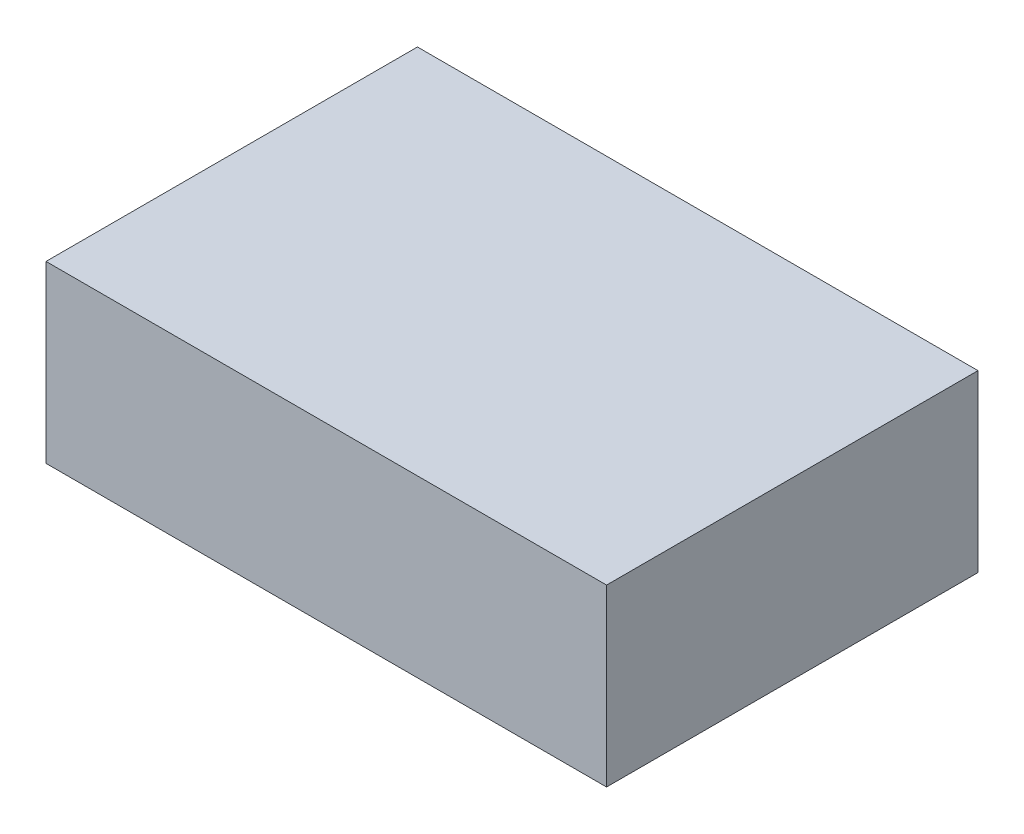
ISO-10303-21;
HEADER;
FILE_DESCRIPTION(('STEP AP214'),'2;1');
FILE_NAME('part.step','',(''),(''),'','','');
FILE_SCHEMA(('AUTOMOTIVE_DESIGN { 1 0 10303 214 1 1 1 1 }'));
ENDSEC;
DATA;
#1=APPLICATION_CONTEXT('core data for automotive mechanical design processes');
#2=APPLICATION_PROTOCOL_DEFINITION('international standard','automotive_design',2000,#1);
#3=PRODUCT_CONTEXT('',#1,'mechanical');
#4=PRODUCT('Part','Part','',(#3));
#5=PRODUCT_RELATED_PRODUCT_CATEGORY('part','',(#4));
#6=PRODUCT_DEFINITION_FORMATION('','',#4);
#7=PRODUCT_DEFINITION_CONTEXT('part definition',#1,'design');
#8=PRODUCT_DEFINITION('design','',#6,#7);
#9=PRODUCT_DEFINITION_SHAPE('','',#8);
#10=(LENGTH_UNIT() NAMED_UNIT(*) SI_UNIT(.MILLI.,.METRE.));
#11=(NAMED_UNIT(*) PLANE_ANGLE_UNIT() SI_UNIT($,.RADIAN.));
#12=(NAMED_UNIT(*) SI_UNIT($,.STERADIAN.) SOLID_ANGLE_UNIT());
#13=UNCERTAINTY_MEASURE_WITH_UNIT(LENGTH_MEASURE(1.E-05),#10,'distance_accuracy_value','');
#14=(GEOMETRIC_REPRESENTATION_CONTEXT(3) GLOBAL_UNCERTAINTY_ASSIGNED_CONTEXT((#13)) GLOBAL_UNIT_ASSIGNED_CONTEXT((#10,
#11,#12)) REPRESENTATION_CONTEXT('',''));
#15=CARTESIAN_POINT('',(0.,0.,0.));
#16=DIRECTION('',(0.,0.,1.));
#17=DIRECTION('',(1.,0.,0.));
#18=AXIS2_PLACEMENT_3D('',#15,#16,#17);
#19=CARTESIAN_POINT('',(160.242162983954,138.1,1156.17787113217));
#20=DIRECTION('',(-1.,0.,0.));
#21=DIRECTION('',(0.,0.,1.));
#22=AXIS2_PLACEMENT_3D('',#19,#20,#21);
#23=PLANE('',#22);
#24=DIRECTION('',(0.,0.,-1.));
#25=VECTOR('',#24,1.);
#26=CARTESIAN_POINT('',(160.242162983954,38.1,1156.17787113217));
#27=LINE('',#26,#25);
#28=CARTESIAN_POINT('',(160.242162983954,38.1,1156.17787113217));
#29=VERTEX_POINT('',#28);
#30=CARTESIAN_POINT('',(160.242162983954,38.1,943.822128867827));
#31=VERTEX_POINT('',#30);
#32=EDGE_CURVE('E102',#29,#31,#27,.T.);
#33=ORIENTED_EDGE('',*,*,#32,.T.);
#34=DIRECTION('',(0.,-1.,0.));
#35=VECTOR('',#34,1.);
#36=CARTESIAN_POINT('',(160.242162983954,138.1,943.822128867827));
#37=LINE('',#36,#35);
#38=CARTESIAN_POINT('',(160.242162983954,138.1,943.822128867827));
#39=VERTEX_POINT('',#38);
#40=EDGE_CURVE('E11',#39,#31,#37,.T.);
#41=ORIENTED_EDGE('',*,*,#40,.F.);
#42=DIRECTION('',(0.,0.,-1.));
#43=VECTOR('',#42,1.);
#44=CARTESIAN_POINT('',(160.242162983954,138.1,1156.17787113217));
#45=LINE('',#44,#43);
#46=CARTESIAN_POINT('',(160.242162983954,138.1,1156.17787113217));
#47=VERTEX_POINT('',#46);
#48=EDGE_CURVE('E90',#47,#39,#45,.T.);
#49=ORIENTED_EDGE('',*,*,#48,.F.);
#50=DIRECTION('',(0.,-1.,0.));
#51=VECTOR('',#50,1.);
#52=CARTESIAN_POINT('',(160.242162983954,138.1,1156.17787113217));
#53=LINE('',#52,#51);
#54=EDGE_CURVE('E98',#47,#29,#53,.T.);
#55=ORIENTED_EDGE('',*,*,#54,.T.);
#56=EDGE_LOOP('',(#33,#41,#49,#55));
#57=FACE_BOUND('',#56,.T.);
#58=ADVANCED_FACE('F39',(#57),#23,.F.);
#59=CARTESIAN_POINT('',(-160.242162983954,138.1,943.822128867827));
#60=DIRECTION('',(0.,0.,1.));
#61=DIRECTION('',(1.,0.,0.));
#62=AXIS2_PLACEMENT_3D('',#59,#60,#61);
#63=PLANE('',#62);
#64=DIRECTION('',(-1.,0.,0.));
#65=VECTOR('',#64,1.);
#66=CARTESIAN_POINT('',(-160.242162983954,38.1,943.822128867827));
#67=LINE('',#66,#65);
#68=CARTESIAN_POINT('',(-160.242162983954,38.1,943.822128867827));
#69=VERTEX_POINT('',#68);
#70=EDGE_CURVE('E94',#31,#69,#67,.T.);
#71=ORIENTED_EDGE('',*,*,#70,.T.);
#72=DIRECTION('',(0.,-1.,0.));
#73=VECTOR('',#72,1.);
#74=CARTESIAN_POINT('',(-160.242162983954,138.1,943.822128867827));
#75=LINE('',#74,#73);
#76=CARTESIAN_POINT('',(-160.242162983954,138.1,943.822128867827));
#77=VERTEX_POINT('',#76);
#78=EDGE_CURVE('E47',#77,#69,#75,.T.);
#79=ORIENTED_EDGE('',*,*,#78,.F.);
#80=DIRECTION('',(-1.,0.,0.));
#81=VECTOR('',#80,1.);
#82=CARTESIAN_POINT('',(-160.242162983954,138.1,943.822128867827));
#83=LINE('',#82,#81);
#84=EDGE_CURVE('E85',#39,#77,#83,.T.);
#85=ORIENTED_EDGE('',*,*,#84,.F.);
#86=ORIENTED_EDGE('',*,*,#40,.T.);
#87=EDGE_LOOP('',(#71,#79,#85,#86));
#88=FACE_BOUND('',#87,.T.);
#89=ADVANCED_FACE('F93',(#88),#63,.F.);
#90=CARTESIAN_POINT('',(-160.242162983954,138.1,1156.17787113217));
#91=DIRECTION('',(1.,0.,0.));
#92=DIRECTION('',(0.,0.,-1.));
#93=AXIS2_PLACEMENT_3D('',#90,#91,#92);
#94=PLANE('',#93);
#95=DIRECTION('',(0.,0.,1.));
#96=VECTOR('',#95,1.);
#97=CARTESIAN_POINT('',(-160.242162983954,38.1,1156.17787113217));
#98=LINE('',#97,#96);
#99=CARTESIAN_POINT('',(-160.242162983954,38.1,1156.17787113217));
#100=VERTEX_POINT('',#99);
#101=EDGE_CURVE('E72',#69,#100,#98,.T.);
#102=ORIENTED_EDGE('',*,*,#101,.T.);
#103=DIRECTION('',(0.,-1.,0.));
#104=VECTOR('',#103,1.);
#105=CARTESIAN_POINT('',(-160.242162983954,138.1,1156.17787113217));
#106=LINE('',#105,#104);
#107=CARTESIAN_POINT('',(-160.242162983954,138.1,1156.17787113217));
#108=VERTEX_POINT('',#107);
#109=EDGE_CURVE('E95',#108,#100,#106,.T.);
#110=ORIENTED_EDGE('',*,*,#109,.F.);
#111=DIRECTION('',(0.,0.,1.));
#112=VECTOR('',#111,1.);
#113=CARTESIAN_POINT('',(-160.242162983954,138.1,1156.17787113217));
#114=LINE('',#113,#112);
#115=EDGE_CURVE('E88',#77,#108,#114,.T.);
#116=ORIENTED_EDGE('',*,*,#115,.F.);
#117=ORIENTED_EDGE('',*,*,#78,.T.);
#118=EDGE_LOOP('',(#102,#110,#116,#117));
#119=FACE_BOUND('',#118,.T.);
#120=ADVANCED_FACE('F96',(#119),#94,.F.);
#121=CARTESIAN_POINT('',(-160.242162983954,138.1,1156.17787113217));
#122=DIRECTION('',(0.,0.,-1.));
#123=DIRECTION('',(-1.,0.,0.));
#124=AXIS2_PLACEMENT_3D('',#121,#122,#123);
#125=PLANE('',#124);
#126=DIRECTION('',(1.,0.,0.));
#127=VECTOR('',#126,1.);
#128=CARTESIAN_POINT('',(-160.242162983954,38.1,1156.17787113217));
#129=LINE('',#128,#127);
#130=EDGE_CURVE('E78',#100,#29,#129,.T.);
#131=ORIENTED_EDGE('',*,*,#130,.T.);
#132=ORIENTED_EDGE('',*,*,#54,.F.);
#133=DIRECTION('',(1.,0.,0.));
#134=VECTOR('',#133,1.);
#135=CARTESIAN_POINT('',(-160.242162983954,138.1,1156.17787113217));
#136=LINE('',#135,#134);
#137=EDGE_CURVE('E55',#108,#47,#136,.T.);
#138=ORIENTED_EDGE('',*,*,#137,.F.);
#139=ORIENTED_EDGE('',*,*,#109,.T.);
#140=EDGE_LOOP('',(#131,#132,#138,#139));
#141=FACE_BOUND('',#140,.T.);
#142=ADVANCED_FACE('F109',(#141),#125,.F.);
#143=CARTESIAN_POINT('',(0.,138.1,0.));
#144=DIRECTION('',(0.,-1.,0.));
#145=DIRECTION('',(0.,0.,-1.));
#146=AXIS2_PLACEMENT_3D('',#143,#144,#145);
#147=PLANE('',#146);
#148=ORIENTED_EDGE('',*,*,#48,.T.);
#149=ORIENTED_EDGE('',*,*,#84,.T.);
#150=ORIENTED_EDGE('',*,*,#115,.T.);
#151=ORIENTED_EDGE('',*,*,#137,.T.);
#152=EDGE_LOOP('',(#148,#149,#150,#151));
#153=FACE_BOUND('',#152,.T.);
#154=ADVANCED_FACE('F86',(#153),#147,.F.);
#155=CARTESIAN_POINT('',(0.,38.1,0.));
#156=DIRECTION('',(0.,-1.,0.));
#157=DIRECTION('',(0.,0.,-1.));
#158=AXIS2_PLACEMENT_3D('',#155,#156,#157);
#159=PLANE('',#158);
#160=ORIENTED_EDGE('',*,*,#32,.F.);
#161=ORIENTED_EDGE('',*,*,#130,.F.);
#162=ORIENTED_EDGE('',*,*,#101,.F.);
#163=ORIENTED_EDGE('',*,*,#70,.F.);
#164=EDGE_LOOP('',(#160,#161,#162,#163));
#165=FACE_BOUND('',#164,.T.);
#166=ADVANCED_FACE('F112',(#165),#159,.T.);
#167=CLOSED_SHELL('',(#58,#89,#120,#142,#154,#166));
#168=MANIFOLD_SOLID_BREP('B2',#167);
#169=ADVANCED_BREP_SHAPE_REPRESENTATION('',(#18,#168),#14);
#170=SHAPE_DEFINITION_REPRESENTATION(#9,#169);
ENDSEC;
END-ISO-10303-21;
